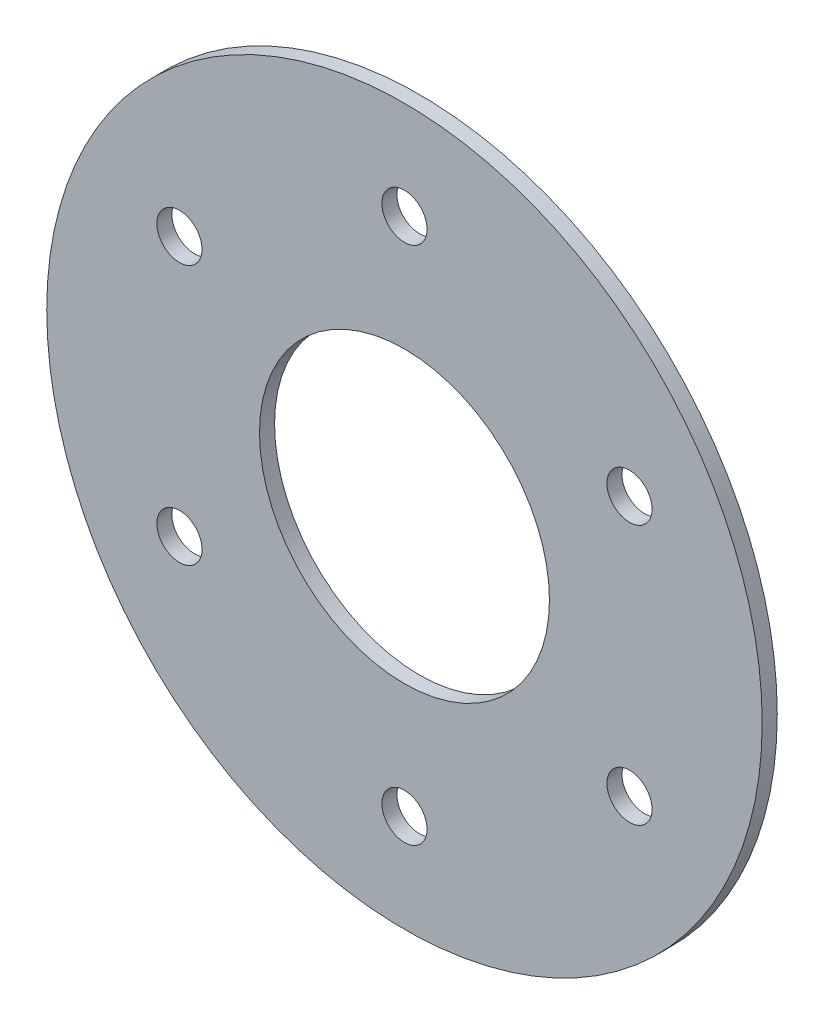
ISO-10303-21;
HEADER;
FILE_DESCRIPTION(('STEP AP214'),'2;1');
FILE_NAME('part.step','',(''),(''),'','','');
FILE_SCHEMA(('AUTOMOTIVE_DESIGN { 1 0 10303 214 1 1 1 1 }'));
ENDSEC;
DATA;
#1=APPLICATION_CONTEXT('core data for automotive mechanical design processes');
#2=APPLICATION_PROTOCOL_DEFINITION('international standard','automotive_design',2000,#1);
#3=PRODUCT_CONTEXT('',#1,'mechanical');
#4=PRODUCT('Part','Part','',(#3));
#5=PRODUCT_RELATED_PRODUCT_CATEGORY('part','',(#4));
#6=PRODUCT_DEFINITION_FORMATION('','',#4);
#7=PRODUCT_DEFINITION_CONTEXT('part definition',#1,'design');
#8=PRODUCT_DEFINITION('design','',#6,#7);
#9=PRODUCT_DEFINITION_SHAPE('','',#8);
#10=(LENGTH_UNIT() NAMED_UNIT(*) SI_UNIT(.MILLI.,.METRE.));
#11=(NAMED_UNIT(*) PLANE_ANGLE_UNIT() SI_UNIT($,.RADIAN.));
#12=(NAMED_UNIT(*) SI_UNIT($,.STERADIAN.) SOLID_ANGLE_UNIT());
#13=UNCERTAINTY_MEASURE_WITH_UNIT(LENGTH_MEASURE(1.E-05),#10,'distance_accuracy_value','');
#14=(GEOMETRIC_REPRESENTATION_CONTEXT(3) GLOBAL_UNCERTAINTY_ASSIGNED_CONTEXT((#13)) GLOBAL_UNIT_ASSIGNED_CONTEXT((#10,
#11,#12)) REPRESENTATION_CONTEXT('',''));
#15=CARTESIAN_POINT('',(0.,0.,0.));
#16=DIRECTION('',(0.,0.,1.));
#17=DIRECTION('',(1.,0.,0.));
#18=AXIS2_PLACEMENT_3D('',#15,#16,#17);
#19=CARTESIAN_POINT('',(0.,0.,4.));
#20=DIRECTION('',(0.,0.,1.));
#21=DIRECTION('',(1.,0.,0.));
#22=AXIS2_PLACEMENT_3D('',#19,#20,#21);
#23=PLANE('',#22);
#24=CARTESIAN_POINT('',(-59.7557528611262,-34.5,4.));
#25=DIRECTION('',(0.,0.,1.));
#26=DIRECTION('',(1.,0.,0.));
#27=AXIS2_PLACEMENT_3D('',#24,#25,#26);
#28=CIRCLE('',#27,5.99999999999999);
#29=CARTESIAN_POINT('',(-53.7557528611262,-34.5,4.));
#30=VERTEX_POINT('',#29);
#31=EDGE_CURVE('E75',#30,#30,#28,.T.);
#32=ORIENTED_EDGE('',*,*,#31,.F.);
#33=EDGE_LOOP('',(#32));
#34=FACE_BOUND('',#33,.T.);
#35=CARTESIAN_POINT('',(59.7557528611263,-34.5,4.));
#36=DIRECTION('',(0.,0.,1.));
#37=DIRECTION('',(1.,0.,0.));
#38=AXIS2_PLACEMENT_3D('',#35,#36,#37);
#39=CIRCLE('',#38,5.99999999999999);
#40=CARTESIAN_POINT('',(65.7557528611263,-34.5,4.));
#41=VERTEX_POINT('',#40);
#42=EDGE_CURVE('E63',#41,#41,#39,.T.);
#43=ORIENTED_EDGE('',*,*,#42,.F.);
#44=EDGE_LOOP('',(#43));
#45=FACE_BOUND('',#44,.T.);
#46=CARTESIAN_POINT('',(0.,69.,4.));
#47=DIRECTION('',(0.,0.,1.));
#48=DIRECTION('',(1.,0.,0.));
#49=AXIS2_PLACEMENT_3D('',#46,#47,#48);
#50=CIRCLE('',#49,6.);
#51=CARTESIAN_POINT('',(6.,69.,4.));
#52=VERTEX_POINT('',#51);
#53=EDGE_CURVE('E51',#52,#52,#50,.T.);
#54=ORIENTED_EDGE('',*,*,#53,.F.);
#55=EDGE_LOOP('',(#54));
#56=FACE_BOUND('',#55,.T.);
#57=CARTESIAN_POINT('',(0.,0.,4.));
#58=DIRECTION('',(0.,0.,1.));
#59=DIRECTION('',(1.,0.,0.));
#60=AXIS2_PLACEMENT_3D('',#57,#58,#59);
#61=CIRCLE('',#60,95.);
#62=CARTESIAN_POINT('',(95.,0.,4.));
#63=VERTEX_POINT('',#62);
#64=EDGE_CURVE('E10',#63,#63,#61,.T.);
#65=ORIENTED_EDGE('',*,*,#64,.T.);
#66=EDGE_LOOP('',(#65));
#67=FACE_BOUND('',#66,.T.);
#68=CARTESIAN_POINT('',(0.,0.,4.));
#69=DIRECTION('',(0.,0.,1.));
#70=DIRECTION('',(1.,0.,0.));
#71=AXIS2_PLACEMENT_3D('',#68,#69,#70);
#72=CIRCLE('',#71,38.5);
#73=CARTESIAN_POINT('',(38.5,0.,4.));
#74=VERTEX_POINT('',#73);
#75=EDGE_CURVE('E46',#74,#74,#72,.T.);
#76=ORIENTED_EDGE('',*,*,#75,.F.);
#77=EDGE_LOOP('',(#76));
#78=FACE_BOUND('',#77,.T.);
#79=CARTESIAN_POINT('',(59.7557528611262,34.5,4.));
#80=DIRECTION('',(0.,0.,1.));
#81=DIRECTION('',(1.,0.,0.));
#82=AXIS2_PLACEMENT_3D('',#79,#80,#81);
#83=CIRCLE('',#82,5.99999999999999);
#84=CARTESIAN_POINT('',(65.7557528611262,34.5,4.));
#85=VERTEX_POINT('',#84);
#86=EDGE_CURVE('E57',#85,#85,#83,.T.);
#87=ORIENTED_EDGE('',*,*,#86,.F.);
#88=EDGE_LOOP('',(#87));
#89=FACE_BOUND('',#88,.T.);
#90=CARTESIAN_POINT('',(0.,-69.,4.));
#91=DIRECTION('',(0.,0.,1.));
#92=DIRECTION('',(1.,0.,0.));
#93=AXIS2_PLACEMENT_3D('',#90,#91,#92);
#94=CIRCLE('',#93,6.);
#95=CARTESIAN_POINT('',(6.00000000000001,-69.,4.));
#96=VERTEX_POINT('',#95);
#97=EDGE_CURVE('E69',#96,#96,#94,.T.);
#98=ORIENTED_EDGE('',*,*,#97,.F.);
#99=EDGE_LOOP('',(#98));
#100=FACE_BOUND('',#99,.T.);
#101=CARTESIAN_POINT('',(-59.7557528611263,34.5,4.));
#102=DIRECTION('',(0.,0.,1.));
#103=DIRECTION('',(1.,0.,0.));
#104=AXIS2_PLACEMENT_3D('',#101,#102,#103);
#105=CIRCLE('',#104,5.99999999999999);
#106=CARTESIAN_POINT('',(-53.7557528611263,34.5,4.));
#107=VERTEX_POINT('',#106);
#108=EDGE_CURVE('E81',#107,#107,#105,.T.);
#109=ORIENTED_EDGE('',*,*,#108,.F.);
#110=EDGE_LOOP('',(#109));
#111=FACE_BOUND('',#110,.T.);
#112=ADVANCED_FACE('F35',(#34,#45,#56,#67,#78,#89,#100,#111),#23,.T.);
#113=CARTESIAN_POINT('',(0.,0.,0.));
#114=DIRECTION('',(0.,0.,1.));
#115=DIRECTION('',(1.,0.,0.));
#116=AXIS2_PLACEMENT_3D('',#113,#114,#115);
#117=PLANE('',#116);
#118=CARTESIAN_POINT('',(0.,0.,0.));
#119=DIRECTION('',(0.,0.,1.));
#120=DIRECTION('',(1.,0.,0.));
#121=AXIS2_PLACEMENT_3D('',#118,#119,#120);
#122=CIRCLE('',#121,95.);
#123=CARTESIAN_POINT('',(95.,0.,0.));
#124=VERTEX_POINT('',#123);
#125=EDGE_CURVE('E39',#124,#124,#122,.T.);
#126=ORIENTED_EDGE('',*,*,#125,.F.);
#127=EDGE_LOOP('',(#126));
#128=FACE_BOUND('',#127,.T.);
#129=CARTESIAN_POINT('',(0.,0.,0.));
#130=DIRECTION('',(0.,0.,1.));
#131=DIRECTION('',(1.,0.,0.));
#132=AXIS2_PLACEMENT_3D('',#129,#130,#131);
#133=CIRCLE('',#132,38.5);
#134=CARTESIAN_POINT('',(38.5,0.,0.));
#135=VERTEX_POINT('',#134);
#136=EDGE_CURVE('E48',#135,#135,#133,.T.);
#137=ORIENTED_EDGE('',*,*,#136,.T.);
#138=EDGE_LOOP('',(#137));
#139=FACE_BOUND('',#138,.T.);
#140=CARTESIAN_POINT('',(0.,69.,0.));
#141=DIRECTION('',(0.,0.,1.));
#142=DIRECTION('',(1.,0.,0.));
#143=AXIS2_PLACEMENT_3D('',#140,#141,#142);
#144=CIRCLE('',#143,6.);
#145=CARTESIAN_POINT('',(6.,69.,0.));
#146=VERTEX_POINT('',#145);
#147=EDGE_CURVE('E54',#146,#146,#144,.T.);
#148=ORIENTED_EDGE('',*,*,#147,.T.);
#149=EDGE_LOOP('',(#148));
#150=FACE_BOUND('',#149,.T.);
#151=CARTESIAN_POINT('',(59.7557528611262,34.5,0.));
#152=DIRECTION('',(0.,0.,1.));
#153=DIRECTION('',(1.,0.,0.));
#154=AXIS2_PLACEMENT_3D('',#151,#152,#153);
#155=CIRCLE('',#154,5.99999999999999);
#156=CARTESIAN_POINT('',(65.7557528611262,34.5,0.));
#157=VERTEX_POINT('',#156);
#158=EDGE_CURVE('E60',#157,#157,#155,.T.);
#159=ORIENTED_EDGE('',*,*,#158,.T.);
#160=EDGE_LOOP('',(#159));
#161=FACE_BOUND('',#160,.T.);
#162=CARTESIAN_POINT('',(59.7557528611263,-34.5,0.));
#163=DIRECTION('',(0.,0.,1.));
#164=DIRECTION('',(1.,0.,0.));
#165=AXIS2_PLACEMENT_3D('',#162,#163,#164);
#166=CIRCLE('',#165,5.99999999999999);
#167=CARTESIAN_POINT('',(65.7557528611263,-34.5,0.));
#168=VERTEX_POINT('',#167);
#169=EDGE_CURVE('E66',#168,#168,#166,.T.);
#170=ORIENTED_EDGE('',*,*,#169,.T.);
#171=EDGE_LOOP('',(#170));
#172=FACE_BOUND('',#171,.T.);
#173=CARTESIAN_POINT('',(0.,-69.,0.));
#174=DIRECTION('',(0.,0.,1.));
#175=DIRECTION('',(1.,0.,0.));
#176=AXIS2_PLACEMENT_3D('',#173,#174,#175);
#177=CIRCLE('',#176,6.);
#178=CARTESIAN_POINT('',(6.00000000000001,-69.,0.));
#179=VERTEX_POINT('',#178);
#180=EDGE_CURVE('E72',#179,#179,#177,.T.);
#181=ORIENTED_EDGE('',*,*,#180,.T.);
#182=EDGE_LOOP('',(#181));
#183=FACE_BOUND('',#182,.T.);
#184=CARTESIAN_POINT('',(-59.7557528611262,-34.5,0.));
#185=DIRECTION('',(0.,0.,1.));
#186=DIRECTION('',(1.,0.,0.));
#187=AXIS2_PLACEMENT_3D('',#184,#185,#186);
#188=CIRCLE('',#187,5.99999999999999);
#189=CARTESIAN_POINT('',(-53.7557528611262,-34.5,0.));
#190=VERTEX_POINT('',#189);
#191=EDGE_CURVE('E78',#190,#190,#188,.T.);
#192=ORIENTED_EDGE('',*,*,#191,.T.);
#193=EDGE_LOOP('',(#192));
#194=FACE_BOUND('',#193,.T.);
#195=CARTESIAN_POINT('',(-59.7557528611263,34.5,0.));
#196=DIRECTION('',(0.,0.,1.));
#197=DIRECTION('',(1.,0.,0.));
#198=AXIS2_PLACEMENT_3D('',#195,#196,#197);
#199=CIRCLE('',#198,5.99999999999999);
#200=CARTESIAN_POINT('',(-53.7557528611263,34.5,0.));
#201=VERTEX_POINT('',#200);
#202=EDGE_CURVE('E84',#201,#201,#199,.T.);
#203=ORIENTED_EDGE('',*,*,#202,.T.);
#204=EDGE_LOOP('',(#203));
#205=FACE_BOUND('',#204,.T.);
#206=ADVANCED_FACE('F94',(#128,#139,#150,#161,#172,#183,#194,#205),#117,.F.);
#207=CARTESIAN_POINT('',(0.,0.,4.));
#208=DIRECTION('',(0.,0.,-1.));
#209=DIRECTION('',(-1.,0.,0.));
#210=AXIS2_PLACEMENT_3D('',#207,#208,#209);
#211=CYLINDRICAL_SURFACE('',#210,95.);
#212=ORIENTED_EDGE('',*,*,#64,.F.);
#213=EDGE_LOOP('',(#212));
#214=FACE_BOUND('',#213,.T.);
#215=ORIENTED_EDGE('',*,*,#125,.T.);
#216=EDGE_LOOP('',(#215));
#217=FACE_BOUND('',#216,.T.);
#218=ADVANCED_FACE('F37',(#214,#217),#211,.T.);
#219=CARTESIAN_POINT('',(0.,0.,4.));
#220=DIRECTION('',(0.,0.,-1.));
#221=DIRECTION('',(-1.,0.,0.));
#222=AXIS2_PLACEMENT_3D('',#219,#220,#221);
#223=CYLINDRICAL_SURFACE('',#222,38.5);
#224=ORIENTED_EDGE('',*,*,#75,.T.);
#225=EDGE_LOOP('',(#224));
#226=FACE_BOUND('',#225,.T.);
#227=ORIENTED_EDGE('',*,*,#136,.F.);
#228=EDGE_LOOP('',(#227));
#229=FACE_BOUND('',#228,.T.);
#230=ADVANCED_FACE('F104',(#226,#229),#223,.F.);
#231=CARTESIAN_POINT('',(0.,69.,4.));
#232=DIRECTION('',(0.,0.,-1.));
#233=DIRECTION('',(-1.,0.,0.));
#234=AXIS2_PLACEMENT_3D('',#231,#232,#233);
#235=CYLINDRICAL_SURFACE('',#234,6.);
#236=ORIENTED_EDGE('',*,*,#53,.T.);
#237=EDGE_LOOP('',(#236));
#238=FACE_BOUND('',#237,.T.);
#239=ORIENTED_EDGE('',*,*,#147,.F.);
#240=EDGE_LOOP('',(#239));
#241=FACE_BOUND('',#240,.T.);
#242=ADVANCED_FACE('F107',(#238,#241),#235,.F.);
#243=CARTESIAN_POINT('',(59.7557528611262,34.5,4.));
#244=DIRECTION('',(0.,0.,-1.));
#245=DIRECTION('',(-1.,0.,0.));
#246=AXIS2_PLACEMENT_3D('',#243,#244,#245);
#247=CYLINDRICAL_SURFACE('',#246,5.99999999999999);
#248=ORIENTED_EDGE('',*,*,#86,.T.);
#249=EDGE_LOOP('',(#248));
#250=FACE_BOUND('',#249,.T.);
#251=ORIENTED_EDGE('',*,*,#158,.F.);
#252=EDGE_LOOP('',(#251));
#253=FACE_BOUND('',#252,.T.);
#254=ADVANCED_FACE('F111',(#250,#253),#247,.F.);
#255=CARTESIAN_POINT('',(59.7557528611263,-34.5,4.));
#256=DIRECTION('',(0.,0.,-1.));
#257=DIRECTION('',(-1.,0.,0.));
#258=AXIS2_PLACEMENT_3D('',#255,#256,#257);
#259=CYLINDRICAL_SURFACE('',#258,5.99999999999999);
#260=ORIENTED_EDGE('',*,*,#42,.T.);
#261=EDGE_LOOP('',(#260));
#262=FACE_BOUND('',#261,.T.);
#263=ORIENTED_EDGE('',*,*,#169,.F.);
#264=EDGE_LOOP('',(#263));
#265=FACE_BOUND('',#264,.T.);
#266=ADVANCED_FACE('F115',(#262,#265),#259,.F.);
#267=CARTESIAN_POINT('',(0.,-69.,4.));
#268=DIRECTION('',(0.,0.,-1.));
#269=DIRECTION('',(-1.,0.,0.));
#270=AXIS2_PLACEMENT_3D('',#267,#268,#269);
#271=CYLINDRICAL_SURFACE('',#270,6.);
#272=ORIENTED_EDGE('',*,*,#97,.T.);
#273=EDGE_LOOP('',(#272));
#274=FACE_BOUND('',#273,.T.);
#275=ORIENTED_EDGE('',*,*,#180,.F.);
#276=EDGE_LOOP('',(#275));
#277=FACE_BOUND('',#276,.T.);
#278=ADVANCED_FACE('F119',(#274,#277),#271,.F.);
#279=CARTESIAN_POINT('',(-59.7557528611262,-34.5,4.));
#280=DIRECTION('',(0.,0.,-1.));
#281=DIRECTION('',(-1.,0.,0.));
#282=AXIS2_PLACEMENT_3D('',#279,#280,#281);
#283=CYLINDRICAL_SURFACE('',#282,5.99999999999999);
#284=ORIENTED_EDGE('',*,*,#31,.T.);
#285=EDGE_LOOP('',(#284));
#286=FACE_BOUND('',#285,.T.);
#287=ORIENTED_EDGE('',*,*,#191,.F.);
#288=EDGE_LOOP('',(#287));
#289=FACE_BOUND('',#288,.T.);
#290=ADVANCED_FACE('F123',(#286,#289),#283,.F.);
#291=CARTESIAN_POINT('',(-59.7557528611263,34.5,4.));
#292=DIRECTION('',(0.,0.,-1.));
#293=DIRECTION('',(-1.,0.,0.));
#294=AXIS2_PLACEMENT_3D('',#291,#292,#293);
#295=CYLINDRICAL_SURFACE('',#294,5.99999999999999);
#296=ORIENTED_EDGE('',*,*,#108,.T.);
#297=EDGE_LOOP('',(#296));
#298=FACE_BOUND('',#297,.T.);
#299=ORIENTED_EDGE('',*,*,#202,.F.);
#300=EDGE_LOOP('',(#299));
#301=FACE_BOUND('',#300,.T.);
#302=ADVANCED_FACE('F90',(#298,#301),#295,.F.);
#303=CLOSED_SHELL('',(#112,#206,#218,#230,#242,#254,#266,#278,#290,#302));
#304=MANIFOLD_SOLID_BREP('B2',#303);
#305=ADVANCED_BREP_SHAPE_REPRESENTATION('',(#18,#304),#14);
#306=SHAPE_DEFINITION_REPRESENTATION(#9,#305);
ENDSEC;
END-ISO-10303-21;
